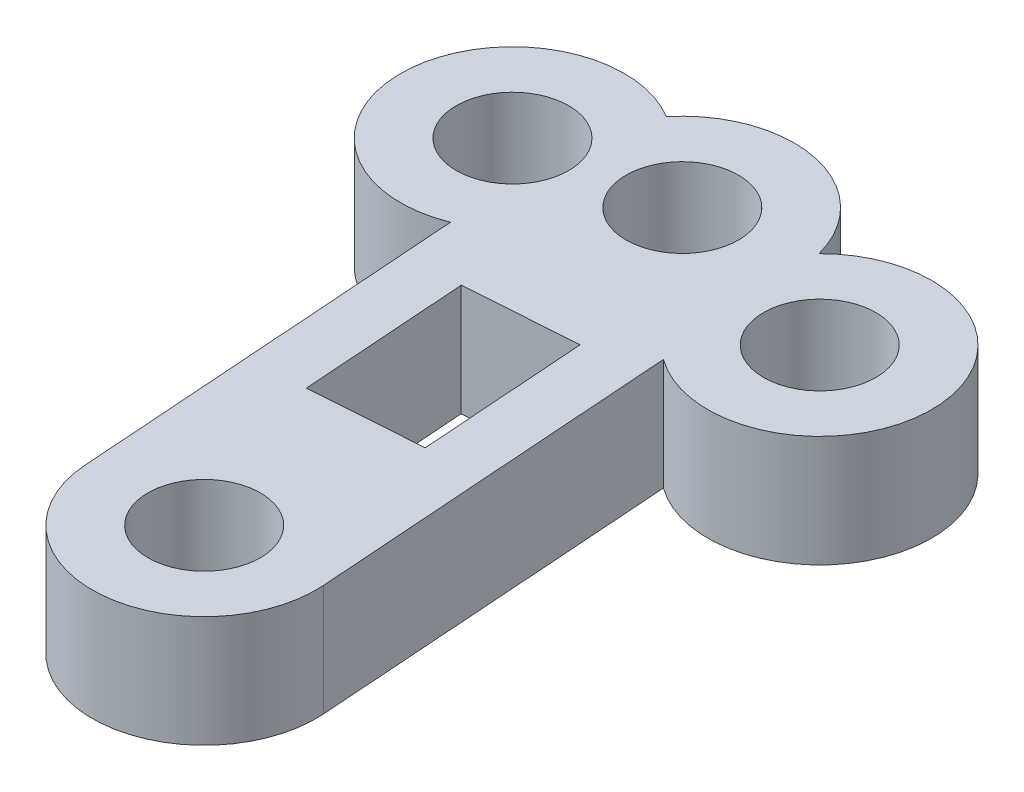
ISO-10303-21;
HEADER;
FILE_DESCRIPTION(('STEP AP214'),'2;1');
FILE_NAME('part.step','',(''),(''),'','','');
FILE_SCHEMA(('AUTOMOTIVE_DESIGN { 1 0 10303 214 1 1 1 1 }'));
ENDSEC;
DATA;
#1=APPLICATION_CONTEXT('core data for automotive mechanical design processes');
#2=APPLICATION_PROTOCOL_DEFINITION('international standard','automotive_design',2000,#1);
#3=PRODUCT_CONTEXT('',#1,'mechanical');
#4=PRODUCT('Part','Part','',(#3));
#5=PRODUCT_RELATED_PRODUCT_CATEGORY('part','',(#4));
#6=PRODUCT_DEFINITION_FORMATION('','',#4);
#7=PRODUCT_DEFINITION_CONTEXT('part definition',#1,'design');
#8=PRODUCT_DEFINITION('design','',#6,#7);
#9=PRODUCT_DEFINITION_SHAPE('','',#8);
#10=(LENGTH_UNIT() NAMED_UNIT(*) SI_UNIT(.MILLI.,.METRE.));
#11=(NAMED_UNIT(*) PLANE_ANGLE_UNIT() SI_UNIT($,.RADIAN.));
#12=(NAMED_UNIT(*) SI_UNIT($,.STERADIAN.) SOLID_ANGLE_UNIT());
#13=UNCERTAINTY_MEASURE_WITH_UNIT(LENGTH_MEASURE(1.E-05),#10,'distance_accuracy_value','');
#14=(GEOMETRIC_REPRESENTATION_CONTEXT(3) GLOBAL_UNCERTAINTY_ASSIGNED_CONTEXT((#13)) GLOBAL_UNIT_ASSIGNED_CONTEXT((#10,
#11,#12)) REPRESENTATION_CONTEXT('',''));
#15=CARTESIAN_POINT('',(0.,0.,0.));
#16=DIRECTION('',(0.,0.,1.));
#17=DIRECTION('',(1.,0.,0.));
#18=AXIS2_PLACEMENT_3D('',#15,#16,#17);
#19=CARTESIAN_POINT('',(-12.9537,10.,-31.7552));
#20=DIRECTION('',(0.,-1.,0.));
#21=DIRECTION('',(0.,0.,-1.));
#22=AXIS2_PLACEMENT_3D('',#19,#20,#21);
#23=CYLINDRICAL_SURFACE('',#22,10.05);
#24=CARTESIAN_POINT('',(-12.9537,0.,-31.7552));
#25=DIRECTION('',(0.,1.,0.));
#26=DIRECTION('',(0.,0.,1.));
#27=AXIS2_PLACEMENT_3D('',#24,#25,#26);
#28=CIRCLE('',#27,10.05);
#29=CARTESIAN_POINT('',(-7.71530217696886,0.,-40.3320110768317));
#30=VERTEX_POINT('',#29);
#31=CARTESIAN_POINT('',(-9.19312816071947,0.,-22.4352965969807));
#32=VERTEX_POINT('',#31);
#33=EDGE_CURVE('E159',#30,#32,#28,.T.);
#34=ORIENTED_EDGE('',*,*,#33,.T.);
#35=DIRECTION('',(0.,-1.,0.));
#36=VECTOR('',#35,1.);
#37=CARTESIAN_POINT('',(-9.19312816071947,10.,-22.4352965969807));
#38=LINE('',#37,#36);
#39=CARTESIAN_POINT('',(-9.19312816071947,10.,-22.4352965969807));
#40=VERTEX_POINT('',#39);
#41=EDGE_CURVE('E11',#40,#32,#38,.T.);
#42=ORIENTED_EDGE('',*,*,#41,.F.);
#43=CARTESIAN_POINT('',(-12.9537,10.,-31.7552));
#44=DIRECTION('',(0.,1.,0.));
#45=DIRECTION('',(0.,0.,1.));
#46=AXIS2_PLACEMENT_3D('',#43,#44,#45);
#47=CIRCLE('',#46,10.05);
#48=CARTESIAN_POINT('',(-7.71530217696886,10.,-40.3320110768317));
#49=VERTEX_POINT('',#48);
#50=EDGE_CURVE('E165',#49,#40,#47,.T.);
#51=ORIENTED_EDGE('',*,*,#50,.F.);
#52=DIRECTION('',(0.,-1.,0.));
#53=VECTOR('',#52,1.);
#54=CARTESIAN_POINT('',(-7.71530217696886,10.,-40.3320110768317));
#55=LINE('',#54,#53);
#56=EDGE_CURVE('E202',#49,#30,#55,.T.);
#57=ORIENTED_EDGE('',*,*,#56,.T.);
#58=EDGE_LOOP('',(#34,#42,#51,#57));
#59=FACE_BOUND('',#58,.T.);
#60=ADVANCED_FACE('F39',(#59),#23,.T.);
#61=CARTESIAN_POINT('',(-7.58011908370864,10.,0.532348903018615));
#62=DIRECTION('',(0.997542985189696,0.,-0.0700570674438313));
#63=DIRECTION('',(-0.0700570674438313,0.,-0.997542985189696));
#64=AXIS2_PLACEMENT_3D('',#61,#62,#63);
#65=PLANE('',#64);
#66=DIRECTION('',(0.0700570674438313,0.,0.997542985189696));
#67=VECTOR('',#66,1.);
#68=CARTESIAN_POINT('',(-7.58011908370864,0.,0.532348903018615));
#69=LINE('',#68,#67);
#70=CARTESIAN_POINT('',(-6.71170700115645,0.,12.8976735278105));
#71=VERTEX_POINT('',#70);
#72=EDGE_CURVE('E206',#32,#71,#69,.T.);
#73=ORIENTED_EDGE('',*,*,#72,.T.);
#74=DIRECTION('',(0.,-1.,0.));
#75=VECTOR('',#74,1.);
#76=CARTESIAN_POINT('',(-6.71170700115645,10.,12.8976735278105));
#77=LINE('',#76,#75);
#78=CARTESIAN_POINT('',(-6.71170700115645,10.,12.8976735278105));
#79=VERTEX_POINT('',#78);
#80=EDGE_CURVE('E47',#79,#71,#77,.T.);
#81=ORIENTED_EDGE('',*,*,#80,.F.);
#82=DIRECTION('',(0.0700570674438313,0.,0.997542985189696));
#83=VECTOR('',#82,1.);
#84=CARTESIAN_POINT('',(-7.58011908370864,10.,0.532348903018615));
#85=LINE('',#84,#83);
#86=EDGE_CURVE('E169',#40,#79,#85,.T.);
#87=ORIENTED_EDGE('',*,*,#86,.F.);
#88=ORIENTED_EDGE('',*,*,#41,.T.);
#89=EDGE_LOOP('',(#73,#81,#87,#88));
#90=FACE_BOUND('',#89,.T.);
#91=ADVANCED_FACE('F274',(#90),#65,.F.);
#92=CARTESIAN_POINT('',(3.3136,10.,12.1936));
#93=DIRECTION('',(0.,-1.,0.));
#94=DIRECTION('',(0.,0.,-1.));
#95=AXIS2_PLACEMENT_3D('',#92,#93,#94);
#96=CYLINDRICAL_SURFACE('',#95,10.05);
#97=CARTESIAN_POINT('',(3.3136,0.,12.1936));
#98=DIRECTION('',(0.,1.,0.));
#99=DIRECTION('',(0.,0.,1.));
#100=AXIS2_PLACEMENT_3D('',#97,#98,#99);
#101=CIRCLE('',#100,10.05);
#102=CARTESIAN_POINT('',(13.3389070011564,0.,11.4895264721895));
#103=VERTEX_POINT('',#102);
#104=EDGE_CURVE('E209',#71,#103,#101,.T.);
#105=ORIENTED_EDGE('',*,*,#104,.T.);
#106=DIRECTION('',(0.,-1.,0.));
#107=VECTOR('',#106,1.);
#108=CARTESIAN_POINT('',(13.3389070011564,10.,11.4895264721895));
#109=LINE('',#108,#107);
#110=CARTESIAN_POINT('',(13.3389070011564,10.,11.4895264721895));
#111=VERTEX_POINT('',#110);
#112=EDGE_CURVE('E248',#111,#103,#109,.T.);
#113=ORIENTED_EDGE('',*,*,#112,.F.);
#114=CARTESIAN_POINT('',(3.3136,10.,12.1936));
#115=DIRECTION('',(0.,1.,0.));
#116=DIRECTION('',(0.,0.,1.));
#117=AXIS2_PLACEMENT_3D('',#114,#115,#116);
#118=CIRCLE('',#117,10.05);
#119=EDGE_CURVE('E173',#79,#111,#118,.T.);
#120=ORIENTED_EDGE('',*,*,#119,.F.);
#121=ORIENTED_EDGE('',*,*,#80,.T.);
#122=EDGE_LOOP('',(#105,#113,#120,#121));
#123=FACE_BOUND('',#122,.T.);
#124=ADVANCED_FACE('F256',(#123),#96,.T.);
#125=CARTESIAN_POINT('',(12.4704949186043,10.,-0.875798152602395));
#126=DIRECTION('',(0.997542985189696,0.,-0.0700570674438313));
#127=DIRECTION('',(-0.0700570674438313,0.,-0.997542985189696));
#128=AXIS2_PLACEMENT_3D('',#125,#126,#127);
#129=PLANE('',#128);
#130=DIRECTION('',(0.0700570674438313,0.,0.997542985189696));
#131=VECTOR('',#130,1.);
#132=CARTESIAN_POINT('',(12.4704949186043,0.,-0.875798152602395));
#133=LINE('',#132,#131);
#134=CARTESIAN_POINT('',(11.0347069906863,0.,-21.3199906941032));
#135=VERTEX_POINT('',#134);
#136=EDGE_CURVE('E213',#135,#103,#133,.T.);
#137=ORIENTED_EDGE('',*,*,#136,.F.);
#138=DIRECTION('',(0.,-1.,0.));
#139=VECTOR('',#138,1.);
#140=CARTESIAN_POINT('',(11.0347069906863,10.,-21.3199906941032));
#141=LINE('',#140,#139);
#142=CARTESIAN_POINT('',(11.0347069906863,10.,-21.3199906941032));
#143=VERTEX_POINT('',#142);
#144=EDGE_CURVE('E245',#143,#135,#141,.T.);
#145=ORIENTED_EDGE('',*,*,#144,.F.);
#146=DIRECTION('',(0.0700570674438313,0.,0.997542985189696));
#147=VECTOR('',#146,1.);
#148=CARTESIAN_POINT('',(12.4704949186043,10.,-0.875798152602395));
#149=LINE('',#148,#147);
#150=EDGE_CURVE('E176',#143,#111,#149,.T.);
#151=ORIENTED_EDGE('',*,*,#150,.T.);
#152=ORIENTED_EDGE('',*,*,#112,.T.);
#153=EDGE_LOOP('',(#137,#145,#151,#152));
#154=FACE_BOUND('',#153,.T.);
#155=ADVANCED_FACE('F265',(#154),#129,.T.);
#156=CARTESIAN_POINT('',(16.9279,10.,-29.4608));
#157=DIRECTION('',(0.,-1.,0.));
#158=DIRECTION('',(0.,0.,-1.));
#159=AXIS2_PLACEMENT_3D('',#156,#157,#158);
#160=CYLINDRICAL_SURFACE('',#159,10.05);
#161=CARTESIAN_POINT('',(16.9279,0.,-29.4608));
#162=DIRECTION('',(0.,1.,0.));
#163=DIRECTION('',(0.,0.,1.));
#164=AXIS2_PLACEMENT_3D('',#161,#162,#163);
#165=CIRCLE('',#164,10.05);
#166=CARTESIAN_POINT('',(9.79004740566324,0.,-36.5356540862353));
#167=VERTEX_POINT('',#166);
#168=EDGE_CURVE('E217',#135,#167,#165,.T.);
#169=ORIENTED_EDGE('',*,*,#168,.T.);
#170=DIRECTION('',(0.,-1.,0.));
#171=VECTOR('',#170,1.);
#172=CARTESIAN_POINT('',(9.79004740566324,10.,-36.5356540862353));
#173=LINE('',#172,#171);
#174=CARTESIAN_POINT('',(9.79004740566324,10.,-36.5356540862353));
#175=VERTEX_POINT('',#174);
#176=EDGE_CURVE('E241',#175,#167,#173,.T.);
#177=ORIENTED_EDGE('',*,*,#176,.F.);
#178=CARTESIAN_POINT('',(16.9279,10.,-29.4608));
#179=DIRECTION('',(0.,1.,0.));
#180=DIRECTION('',(0.,0.,1.));
#181=AXIS2_PLACEMENT_3D('',#178,#179,#180);
#182=CIRCLE('',#181,10.05);
#183=EDGE_CURVE('E180',#143,#175,#182,.T.);
#184=ORIENTED_EDGE('',*,*,#183,.F.);
#185=ORIENTED_EDGE('',*,*,#144,.T.);
#186=EDGE_LOOP('',(#169,#177,#184,#185));
#187=FACE_BOUND('',#186,.T.);
#188=ADVANCED_FACE('F281',(#187),#160,.T.);
#189=CARTESIAN_POINT('',(0.0709999999999877,10.,-33.9778));
#190=DIRECTION('',(0.,-1.,0.));
#191=DIRECTION('',(0.,0.,-1.));
#192=AXIS2_PLACEMENT_3D('',#189,#190,#191);
#193=CYLINDRICAL_SURFACE('',#192,5.05);
#194=CARTESIAN_POINT('',(0.0709999999999877,10.,-33.9778));
#195=DIRECTION('',(0.,1.,0.));
#196=DIRECTION('',(0.,0.,1.));
#197=AXIS2_PLACEMENT_3D('',#194,#195,#196);
#198=CIRCLE('',#197,5.05);
#199=CARTESIAN_POINT('',(0.0709999999999877,10.,-28.9278));
#200=VERTEX_POINT('',#199);
#201=EDGE_CURVE('E194',#200,#200,#198,.T.);
#202=ORIENTED_EDGE('',*,*,#201,.T.);
#203=EDGE_LOOP('',(#202));
#204=FACE_BOUND('',#203,.T.);
#205=CARTESIAN_POINT('',(0.0709999999999877,0.,-33.9778));
#206=DIRECTION('',(0.,1.,0.));
#207=DIRECTION('',(0.,0.,1.));
#208=AXIS2_PLACEMENT_3D('',#205,#206,#207);
#209=CIRCLE('',#208,5.05);
#210=CARTESIAN_POINT('',(0.0709999999999877,0.,-28.9278));
#211=VERTEX_POINT('',#210);
#212=EDGE_CURVE('E231',#211,#211,#209,.T.);
#213=ORIENTED_EDGE('',*,*,#212,.F.);
#214=EDGE_LOOP('',(#213));
#215=FACE_BOUND('',#214,.T.);
#216=ADVANCED_FACE('F283',(#204,#215),#193,.F.);
#217=CARTESIAN_POINT('',(16.9279,10.,-29.4608));
#218=DIRECTION('',(0.,-1.,0.));
#219=DIRECTION('',(0.,0.,-1.));
#220=AXIS2_PLACEMENT_3D('',#217,#218,#219);
#221=CYLINDRICAL_SURFACE('',#220,5.05);
#222=CARTESIAN_POINT('',(16.9279,10.,-29.4608));
#223=DIRECTION('',(0.,1.,0.));
#224=DIRECTION('',(0.,0.,1.));
#225=AXIS2_PLACEMENT_3D('',#222,#223,#224);
#226=CIRCLE('',#225,5.05);
#227=CARTESIAN_POINT('',(16.9279,10.,-24.4108));
#228=VERTEX_POINT('',#227);
#229=EDGE_CURVE('E190',#228,#228,#226,.T.);
#230=ORIENTED_EDGE('',*,*,#229,.T.);
#231=EDGE_LOOP('',(#230));
#232=FACE_BOUND('',#231,.T.);
#233=CARTESIAN_POINT('',(16.9279,0.,-29.4608));
#234=DIRECTION('',(0.,1.,0.));
#235=DIRECTION('',(0.,0.,1.));
#236=AXIS2_PLACEMENT_3D('',#233,#234,#235);
#237=CIRCLE('',#236,5.05);
#238=CARTESIAN_POINT('',(16.9279,0.,-24.4108));
#239=VERTEX_POINT('',#238);
#240=EDGE_CURVE('E227',#239,#239,#237,.T.);
#241=ORIENTED_EDGE('',*,*,#240,.F.);
#242=EDGE_LOOP('',(#241));
#243=FACE_BOUND('',#242,.T.);
#244=ADVANCED_FACE('F289',(#232,#243),#221,.F.);
#245=CARTESIAN_POINT('',(-12.9537,10.,-31.7552));
#246=DIRECTION('',(0.,-1.,0.));
#247=DIRECTION('',(0.,0.,-1.));
#248=AXIS2_PLACEMENT_3D('',#245,#246,#247);
#249=CYLINDRICAL_SURFACE('',#248,5.05);
#250=CARTESIAN_POINT('',(-12.9537,10.,-31.7552));
#251=DIRECTION('',(0.,1.,0.));
#252=DIRECTION('',(0.,0.,1.));
#253=AXIS2_PLACEMENT_3D('',#250,#251,#252);
#254=CIRCLE('',#253,5.05);
#255=CARTESIAN_POINT('',(-12.9537,10.,-26.7052));
#256=VERTEX_POINT('',#255);
#257=EDGE_CURVE('E186',#256,#256,#254,.T.);
#258=ORIENTED_EDGE('',*,*,#257,.T.);
#259=EDGE_LOOP('',(#258));
#260=FACE_BOUND('',#259,.T.);
#261=CARTESIAN_POINT('',(-12.9537,0.,-31.7552));
#262=DIRECTION('',(0.,1.,0.));
#263=DIRECTION('',(0.,0.,1.));
#264=AXIS2_PLACEMENT_3D('',#261,#262,#263);
#265=CIRCLE('',#264,5.05);
#266=CARTESIAN_POINT('',(-12.9537,0.,-26.7052));
#267=VERTEX_POINT('',#266);
#268=EDGE_CURVE('E223',#267,#267,#265,.T.);
#269=ORIENTED_EDGE('',*,*,#268,.F.);
#270=EDGE_LOOP('',(#269));
#271=FACE_BOUND('',#270,.T.);
#272=ADVANCED_FACE('F327',(#260,#271),#249,.F.);
#273=CARTESIAN_POINT('',(0.0709999999999877,10.,-33.9778));
#274=DIRECTION('',(0.,-1.,0.));
#275=DIRECTION('',(0.,0.,-1.));
#276=AXIS2_PLACEMENT_3D('',#273,#274,#275);
#277=CYLINDRICAL_SURFACE('',#276,10.05);
#278=CARTESIAN_POINT('',(0.0709999999999877,0.,-33.9778));
#279=DIRECTION('',(0.,1.,0.));
#280=DIRECTION('',(0.,0.,1.));
#281=AXIS2_PLACEMENT_3D('',#278,#279,#280);
#282=CIRCLE('',#281,10.05);
#283=EDGE_CURVE('E220',#167,#30,#282,.T.);
#284=ORIENTED_EDGE('',*,*,#283,.T.);
#285=ORIENTED_EDGE('',*,*,#56,.F.);
#286=CARTESIAN_POINT('',(0.0709999999999877,10.,-33.9778));
#287=DIRECTION('',(0.,1.,0.));
#288=DIRECTION('',(0.,0.,1.));
#289=AXIS2_PLACEMENT_3D('',#286,#287,#288);
#290=CIRCLE('',#289,10.05);
#291=EDGE_CURVE('E183',#175,#49,#290,.T.);
#292=ORIENTED_EDGE('',*,*,#291,.F.);
#293=ORIENTED_EDGE('',*,*,#176,.T.);
#294=EDGE_LOOP('',(#284,#285,#292,#293));
#295=FACE_BOUND('',#294,.T.);
#296=ADVANCED_FACE('F278',(#295),#277,.T.);
#297=CARTESIAN_POINT('',(3.3136,10.,12.1936));
#298=DIRECTION('',(0.,-1.,0.));
#299=DIRECTION('',(0.,0.,-1.));
#300=AXIS2_PLACEMENT_3D('',#297,#298,#299);
#301=CYLINDRICAL_SURFACE('',#300,5.05);
#302=CARTESIAN_POINT('',(3.3136,10.,12.1936));
#303=DIRECTION('',(0.,1.,0.));
#304=DIRECTION('',(0.,0.,1.));
#305=AXIS2_PLACEMENT_3D('',#302,#303,#304);
#306=CIRCLE('',#305,5.05);
#307=CARTESIAN_POINT('',(3.3136,10.,17.2436));
#308=VERTEX_POINT('',#307);
#309=EDGE_CURVE('E198',#308,#308,#306,.T.);
#310=ORIENTED_EDGE('',*,*,#309,.T.);
#311=EDGE_LOOP('',(#310));
#312=FACE_BOUND('',#311,.T.);
#313=CARTESIAN_POINT('',(3.3136,0.,12.1936));
#314=DIRECTION('',(0.,1.,0.));
#315=DIRECTION('',(0.,0.,1.));
#316=AXIS2_PLACEMENT_3D('',#313,#314,#315);
#317=CIRCLE('',#316,5.05);
#318=CARTESIAN_POINT('',(3.3136,0.,17.2436));
#319=VERTEX_POINT('',#318);
#320=EDGE_CURVE('E170',#319,#319,#317,.T.);
#321=ORIENTED_EDGE('',*,*,#320,.F.);
#322=EDGE_LOOP('',(#321));
#323=FACE_BOUND('',#322,.T.);
#324=ADVANCED_FACE('F346',(#312,#323),#301,.F.);
#325=CARTESIAN_POINT('',(0.,10.,0.));
#326=DIRECTION('',(0.,1.,0.));
#327=DIRECTION('',(0.,0.,1.));
#328=AXIS2_PLACEMENT_3D('',#325,#326,#327);
#329=PLANE('',#328);
#330=DIRECTION('',(0.0700570674438313,0.,0.997542985189696));
#331=VECTOR('',#330,1.);
#332=CARTESIAN_POINT('',(-3.8208429317772,10.,-18.0233870517036));
#333=LINE('',#332,#331);
#334=CARTESIAN_POINT('',(-3.8208429317772,10.,-18.0233870517036));
#335=VERTEX_POINT('',#334);
#336=CARTESIAN_POINT('',(-2.76998692011973,10.,-3.06024227385813));
#337=VERTEX_POINT('',#336);
#338=EDGE_CURVE('E54',#335,#337,#333,.T.);
#339=ORIENTED_EDGE('',*,*,#338,.F.);
#340=DIRECTION('',(-0.997542985189696,0.,0.0700570674438315));
#341=VECTOR('',#340,1.);
#342=CARTESIAN_POINT('',(-3.8208429317772,10.,-18.0233870517036));
#343=LINE('',#342,#341);
#344=CARTESIAN_POINT('',(6.15458692011976,10.,-18.7239577261419));
#345=VERTEX_POINT('',#344);
#346=EDGE_CURVE('E137',#345,#335,#343,.T.);
#347=ORIENTED_EDGE('',*,*,#346,.F.);
#348=DIRECTION('',(-0.0700570674438314,0.,-0.997542985189696));
#349=VECTOR('',#348,1.);
#350=CARTESIAN_POINT('',(6.15458692011976,10.,-18.7239577261419));
#351=LINE('',#350,#349);
#352=CARTESIAN_POINT('',(7.20544293177723,10.,-3.76081294829644));
#353=VERTEX_POINT('',#352);
#354=EDGE_CURVE('E141',#353,#345,#351,.T.);
#355=ORIENTED_EDGE('',*,*,#354,.F.);
#356=DIRECTION('',(0.997542985189696,0.,-0.0700570674438312));
#357=VECTOR('',#356,1.);
#358=CARTESIAN_POINT('',(-2.76998692011973,10.,-3.06024227385813));
#359=LINE('',#358,#357);
#360=EDGE_CURVE('E150',#337,#353,#359,.T.);
#361=ORIENTED_EDGE('',*,*,#360,.F.);
#362=EDGE_LOOP('',(#339,#347,#355,#361));
#363=FACE_BOUND('',#362,.T.);
#364=ORIENTED_EDGE('',*,*,#50,.T.);
#365=ORIENTED_EDGE('',*,*,#86,.T.);
#366=ORIENTED_EDGE('',*,*,#119,.T.);
#367=ORIENTED_EDGE('',*,*,#150,.F.);
#368=ORIENTED_EDGE('',*,*,#183,.T.);
#369=ORIENTED_EDGE('',*,*,#291,.T.);
#370=EDGE_LOOP('',(#364,#365,#366,#367,#368,#369));
#371=FACE_BOUND('',#370,.T.);
#372=ORIENTED_EDGE('',*,*,#257,.F.);
#373=EDGE_LOOP('',(#372));
#374=FACE_BOUND('',#373,.T.);
#375=ORIENTED_EDGE('',*,*,#229,.F.);
#376=EDGE_LOOP('',(#375));
#377=FACE_BOUND('',#376,.T.);
#378=ORIENTED_EDGE('',*,*,#201,.F.);
#379=EDGE_LOOP('',(#378));
#380=FACE_BOUND('',#379,.T.);
#381=ORIENTED_EDGE('',*,*,#309,.F.);
#382=EDGE_LOOP('',(#381));
#383=FACE_BOUND('',#382,.T.);
#384=ADVANCED_FACE('F269',(#363,#371,#374,#377,#380,#383),#329,.T.);
#385=CARTESIAN_POINT('',(0.,0.,0.));
#386=DIRECTION('',(0.,1.,0.));
#387=DIRECTION('',(0.,0.,1.));
#388=AXIS2_PLACEMENT_3D('',#385,#386,#387);
#389=PLANE('',#388);
#390=DIRECTION('',(-0.997542985189696,0.,0.0700570674438315));
#391=VECTOR('',#390,1.);
#392=CARTESIAN_POINT('',(-3.8208429317772,0.,-18.0233870517036));
#393=LINE('',#392,#391);
#394=CARTESIAN_POINT('',(6.15458692011976,0.,-18.7239577261419));
#395=VERTEX_POINT('',#394);
#396=CARTESIAN_POINT('',(-3.8208429317772,0.,-18.0233870517036));
#397=VERTEX_POINT('',#396);
#398=EDGE_CURVE('E125',#395,#397,#393,.T.);
#399=ORIENTED_EDGE('',*,*,#398,.T.);
#400=DIRECTION('',(0.0700570674438313,0.,0.997542985189696));
#401=VECTOR('',#400,1.);
#402=CARTESIAN_POINT('',(-3.8208429317772,0.,-18.0233870517036));
#403=LINE('',#402,#401);
#404=CARTESIAN_POINT('',(-2.76998692011973,0.,-3.06024227385813));
#405=VERTEX_POINT('',#404);
#406=EDGE_CURVE('E118',#397,#405,#403,.T.);
#407=ORIENTED_EDGE('',*,*,#406,.T.);
#408=DIRECTION('',(0.997542985189696,0.,-0.0700570674438312));
#409=VECTOR('',#408,1.);
#410=CARTESIAN_POINT('',(-2.76998692011973,0.,-3.06024227385813));
#411=LINE('',#410,#409);
#412=CARTESIAN_POINT('',(7.20544293177723,0.,-3.76081294829644));
#413=VERTEX_POINT('',#412);
#414=EDGE_CURVE('E128',#405,#413,#411,.T.);
#415=ORIENTED_EDGE('',*,*,#414,.T.);
#416=DIRECTION('',(-0.0700570674438314,0.,-0.997542985189696));
#417=VECTOR('',#416,1.);
#418=CARTESIAN_POINT('',(6.15458692011976,0.,-18.7239577261419));
#419=LINE('',#418,#417);
#420=EDGE_CURVE('E62',#413,#395,#419,.T.);
#421=ORIENTED_EDGE('',*,*,#420,.T.);
#422=EDGE_LOOP('',(#399,#407,#415,#421));
#423=FACE_BOUND('',#422,.T.);
#424=ORIENTED_EDGE('',*,*,#33,.F.);
#425=ORIENTED_EDGE('',*,*,#283,.F.);
#426=ORIENTED_EDGE('',*,*,#168,.F.);
#427=ORIENTED_EDGE('',*,*,#136,.T.);
#428=ORIENTED_EDGE('',*,*,#104,.F.);
#429=ORIENTED_EDGE('',*,*,#72,.F.);
#430=EDGE_LOOP('',(#424,#425,#426,#427,#428,#429));
#431=FACE_BOUND('',#430,.T.);
#432=ORIENTED_EDGE('',*,*,#268,.T.);
#433=EDGE_LOOP('',(#432));
#434=FACE_BOUND('',#433,.T.);
#435=ORIENTED_EDGE('',*,*,#240,.T.);
#436=EDGE_LOOP('',(#435));
#437=FACE_BOUND('',#436,.T.);
#438=ORIENTED_EDGE('',*,*,#212,.T.);
#439=EDGE_LOOP('',(#438));
#440=FACE_BOUND('',#439,.T.);
#441=ORIENTED_EDGE('',*,*,#320,.T.);
#442=EDGE_LOOP('',(#441));
#443=FACE_BOUND('',#442,.T.);
#444=ADVANCED_FACE('F133',(#423,#431,#434,#437,#440,#443),#389,.F.);
#445=CARTESIAN_POINT('',(-3.8208429317772,0.,-18.0233870517036));
#446=DIRECTION('',(-0.997542985189696,0.,0.0700570674438313));
#447=DIRECTION('',(0.0700570674438313,0.,0.997542985189696));
#448=AXIS2_PLACEMENT_3D('',#445,#446,#447);
#449=PLANE('',#448);
#450=ORIENTED_EDGE('',*,*,#338,.T.);
#451=DIRECTION('',(0.,1.,0.));
#452=VECTOR('',#451,1.);
#453=CARTESIAN_POINT('',(-2.76998692011973,0.,-3.06024227385813));
#454=LINE('',#453,#452);
#455=EDGE_CURVE('E114',#405,#337,#454,.T.);
#456=ORIENTED_EDGE('',*,*,#455,.F.);
#457=ORIENTED_EDGE('',*,*,#406,.F.);
#458=DIRECTION('',(0.,1.,0.));
#459=VECTOR('',#458,1.);
#460=CARTESIAN_POINT('',(-3.8208429317772,0.,-18.0233870517036));
#461=LINE('',#460,#459);
#462=EDGE_CURVE('E156',#397,#335,#461,.T.);
#463=ORIENTED_EDGE('',*,*,#462,.T.);
#464=EDGE_LOOP('',(#450,#456,#457,#463));
#465=FACE_BOUND('',#464,.T.);
#466=ADVANCED_FACE('F116',(#465),#449,.F.);
#467=CARTESIAN_POINT('',(-3.8208429317772,0.,-18.0233870517036));
#468=DIRECTION('',(-0.0700570674438315,0.,-0.997542985189696));
#469=DIRECTION('',(-0.997542985189696,0.,0.0700570674438315));
#470=AXIS2_PLACEMENT_3D('',#467,#468,#469);
#471=PLANE('',#470);
#472=ORIENTED_EDGE('',*,*,#346,.T.);
#473=ORIENTED_EDGE('',*,*,#462,.F.);
#474=ORIENTED_EDGE('',*,*,#398,.F.);
#475=DIRECTION('',(0.,1.,0.));
#476=VECTOR('',#475,1.);
#477=CARTESIAN_POINT('',(6.15458692011976,0.,-18.7239577261419));
#478=LINE('',#477,#476);
#479=EDGE_CURVE('E160',#395,#345,#478,.T.);
#480=ORIENTED_EDGE('',*,*,#479,.T.);
#481=EDGE_LOOP('',(#472,#473,#474,#480));
#482=FACE_BOUND('',#481,.T.);
#483=ADVANCED_FACE('F384',(#482),#471,.F.);
#484=CARTESIAN_POINT('',(6.15458692011976,0.,-18.7239577261419));
#485=DIRECTION('',(0.997542985189696,0.,-0.0700570674438314));
#486=DIRECTION('',(-0.0700570674438314,0.,-0.997542985189696));
#487=AXIS2_PLACEMENT_3D('',#484,#485,#486);
#488=PLANE('',#487);
#489=ORIENTED_EDGE('',*,*,#354,.T.);
#490=ORIENTED_EDGE('',*,*,#479,.F.);
#491=ORIENTED_EDGE('',*,*,#420,.F.);
#492=DIRECTION('',(0.,1.,0.));
#493=VECTOR('',#492,1.);
#494=CARTESIAN_POINT('',(7.20544293177723,0.,-3.76081294829644));
#495=LINE('',#494,#493);
#496=EDGE_CURVE('E124',#413,#353,#495,.T.);
#497=ORIENTED_EDGE('',*,*,#496,.T.);
#498=EDGE_LOOP('',(#489,#490,#491,#497));
#499=FACE_BOUND('',#498,.T.);
#500=ADVANCED_FACE('F393',(#499),#488,.F.);
#501=CARTESIAN_POINT('',(-2.76998692011973,0.,-3.06024227385813));
#502=DIRECTION('',(0.0700570674438312,0.,0.997542985189696));
#503=DIRECTION('',(0.997542985189696,0.,-0.0700570674438312));
#504=AXIS2_PLACEMENT_3D('',#501,#502,#503);
#505=PLANE('',#504);
#506=ORIENTED_EDGE('',*,*,#360,.T.);
#507=ORIENTED_EDGE('',*,*,#496,.F.);
#508=ORIENTED_EDGE('',*,*,#414,.F.);
#509=ORIENTED_EDGE('',*,*,#455,.T.);
#510=EDGE_LOOP('',(#506,#507,#508,#509));
#511=FACE_BOUND('',#510,.T.);
#512=ADVANCED_FACE('F129',(#511),#505,.F.);
#513=CLOSED_SHELL('',(#60,#91,#124,#155,#188,#216,#244,#272,#296,#324,#384,#444,#466,#483,#500,#512));
#514=MANIFOLD_SOLID_BREP('B2',#513);
#515=ADVANCED_BREP_SHAPE_REPRESENTATION('',(#18,#514),#14);
#516=SHAPE_DEFINITION_REPRESENTATION(#9,#515);
ENDSEC;
END-ISO-10303-21;
